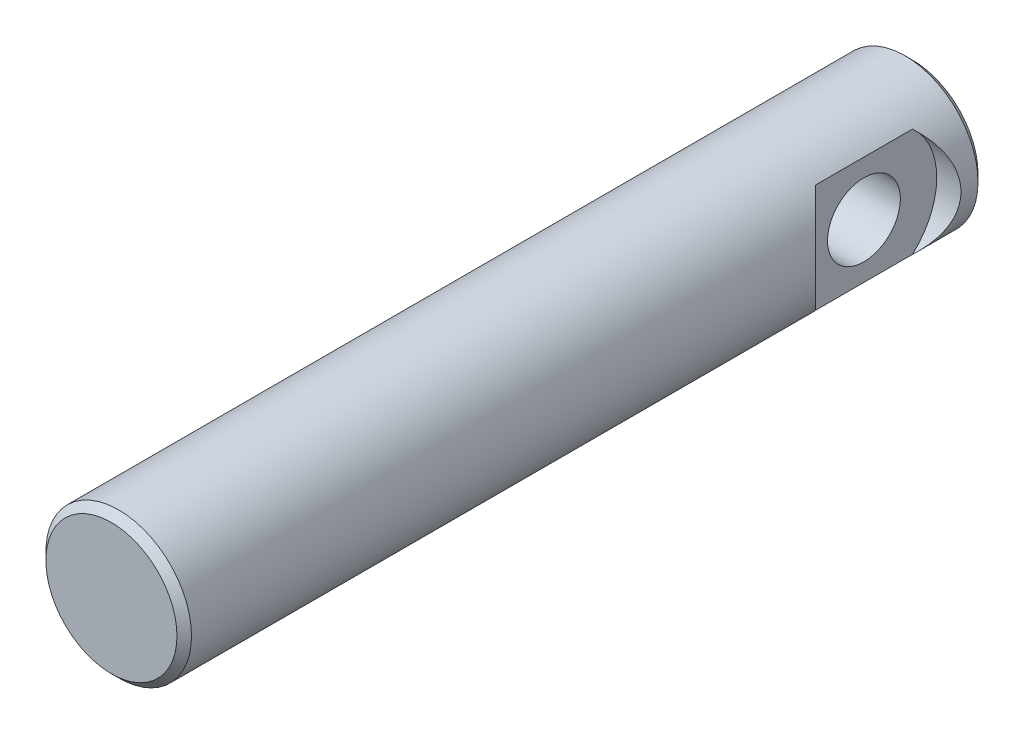
ISO-10303-21;
HEADER;
FILE_DESCRIPTION(('STEP AP214'),'2;1');
FILE_NAME('part.step','',(''),(''),'','','');
FILE_SCHEMA(('AUTOMOTIVE_DESIGN { 1 0 10303 214 1 1 1 1 }'));
ENDSEC;
DATA;
#1=APPLICATION_CONTEXT('core data for automotive mechanical design processes');
#2=APPLICATION_PROTOCOL_DEFINITION('international standard','automotive_design',2000,#1);
#3=PRODUCT_CONTEXT('',#1,'mechanical');
#4=PRODUCT('Part','Part','',(#3));
#5=PRODUCT_RELATED_PRODUCT_CATEGORY('part','',(#4));
#6=PRODUCT_DEFINITION_FORMATION('','',#4);
#7=PRODUCT_DEFINITION_CONTEXT('part definition',#1,'design');
#8=PRODUCT_DEFINITION('design','',#6,#7);
#9=PRODUCT_DEFINITION_SHAPE('','',#8);
#10=(LENGTH_UNIT() NAMED_UNIT(*) SI_UNIT(.MILLI.,.METRE.));
#11=(NAMED_UNIT(*) PLANE_ANGLE_UNIT() SI_UNIT($,.RADIAN.));
#12=(NAMED_UNIT(*) SI_UNIT($,.STERADIAN.) SOLID_ANGLE_UNIT());
#13=UNCERTAINTY_MEASURE_WITH_UNIT(LENGTH_MEASURE(1.E-05),#10,'distance_accuracy_value','');
#14=(GEOMETRIC_REPRESENTATION_CONTEXT(3) GLOBAL_UNCERTAINTY_ASSIGNED_CONTEXT((#13)) GLOBAL_UNIT_ASSIGNED_CONTEXT((#10,
#11,#12)) REPRESENTATION_CONTEXT('',''));
#15=CARTESIAN_POINT('',(0.,0.,0.));
#16=DIRECTION('',(0.,0.,1.));
#17=DIRECTION('',(1.,0.,0.));
#18=AXIS2_PLACEMENT_3D('',#15,#16,#17);
#19=CARTESIAN_POINT('',(0.,0.,33.));
#20=DIRECTION('',(0.,0.,-1.));
#21=DIRECTION('',(-1.,0.,0.));
#22=AXIS2_PLACEMENT_3D('',#19,#20,#21);
#23=CYLINDRICAL_SURFACE('',#22,3.);
#24=CARTESIAN_POINT('',(0.,0.,0.300000000000002));
#25=DIRECTION('',(0.,0.,1.));
#26=DIRECTION('',(1.,0.,0.));
#27=AXIS2_PLACEMENT_3D('',#24,#25,#26);
#28=CIRCLE('',#27,3.);
#29=CARTESIAN_POINT('',(3.,0.,0.300000000000002));
#30=VERTEX_POINT('',#29);
#31=EDGE_CURVE('E115',#30,#30,#28,.T.);
#32=ORIENTED_EDGE('',*,*,#31,.T.);
#33=EDGE_LOOP('',(#32));
#34=FACE_BOUND('',#33,.T.);
#35=CARTESIAN_POINT('',(0.,0.,32.7));
#36=DIRECTION('',(0.,0.,1.));
#37=DIRECTION('',(1.,0.,0.));
#38=AXIS2_PLACEMENT_3D('',#35,#36,#37);
#39=CIRCLE('',#38,3.);
#40=CARTESIAN_POINT('',(3.,0.,32.7));
#41=VERTEX_POINT('',#40);
#42=EDGE_CURVE('E67',#41,#41,#39,.F.);
#43=ORIENTED_EDGE('',*,*,#42,.T.);
#44=EDGE_LOOP('',(#43));
#45=FACE_BOUND('',#44,.T.);
#46=CARTESIAN_POINT('',(0.,0.,4.00000000000001));
#47=DIRECTION('',(-0.707106781186548,0.,-0.707106781186547));
#48=DIRECTION('',(0.707106781186547,0.,-0.707106781186548));
#49=AXIS2_PLACEMENT_3D('',#46,#47,#48);
#50=ELLIPSE('',#49,4.24264068711929,3.);
#51=CARTESIAN_POINT('',(2.,-2.2360679774998,2.00000000000001));
#52=VERTEX_POINT('',#51);
#53=CARTESIAN_POINT('',(2.,2.2360679774998,2.00000000000001));
#54=VERTEX_POINT('',#53);
#55=EDGE_CURVE('E60',#52,#54,#50,.F.);
#56=ORIENTED_EDGE('',*,*,#55,.F.);
#57=DIRECTION('',(0.,0.,-1.));
#58=VECTOR('',#57,1.);
#59=CARTESIAN_POINT('',(2.00000000000002,-2.23606797749977,33.));
#60=LINE('',#59,#58);
#61=CARTESIAN_POINT('',(2.,-2.23606797749979,6.00000000000001));
#62=VERTEX_POINT('',#61);
#63=EDGE_CURVE('E68',#62,#52,#60,.T.);
#64=ORIENTED_EDGE('',*,*,#63,.F.);
#65=CARTESIAN_POINT('',(0.,0.,4.00000000000001));
#66=DIRECTION('',(0.707106781186547,0.,-0.707106781186548));
#67=DIRECTION('',(-0.707106781186548,0.,-0.707106781186547));
#68=AXIS2_PLACEMENT_3D('',#65,#66,#67);
#69=ELLIPSE('',#68,4.24264068711929,3.);
#70=CARTESIAN_POINT('',(2.,2.23606797749979,6.00000000000001));
#71=VERTEX_POINT('',#70);
#72=EDGE_CURVE('E51',#71,#62,#69,.T.);
#73=ORIENTED_EDGE('',*,*,#72,.F.);
#74=DIRECTION('',(0.,0.,-1.));
#75=VECTOR('',#74,1.);
#76=CARTESIAN_POINT('',(2.00000000000002,2.23606797749977,33.));
#77=LINE('',#76,#75);
#78=EDGE_CURVE('E72',#54,#71,#77,.F.);
#79=ORIENTED_EDGE('',*,*,#78,.F.);
#80=EDGE_LOOP('',(#56,#64,#73,#79));
#81=FACE_BOUND('',#80,.T.);
#82=CARTESIAN_POINT('',(-3.,0.,5.50000000000002));
#83=CARTESIAN_POINT('',(-2.99999570107562,0.0788579444268507,5.49999504652423));
#84=CARTESIAN_POINT('',(-2.99685736529635,0.157809899546345,5.49374489031844));
#85=CARTESIAN_POINT('',(-2.98461234055735,0.313380352903346,5.46902067948771));
#86=CARTESIAN_POINT('',(-2.97549431743379,0.389994130070447,5.4505234105033));
#87=CARTESIAN_POINT('',(-2.95224419105063,0.538400317320677,5.40220928707508));
#88=CARTESIAN_POINT('',(-2.93813158766306,0.610210204408723,5.37243642362807));
#89=CARTESIAN_POINT('',(-2.90618664773642,0.747708925209902,5.30264406795254));
#90=CARTESIAN_POINT('',(-2.88835460450288,0.813398240985093,5.26262538362672));
#91=CARTESIAN_POINT('',(-2.84934387387093,0.941261726642869,5.17072412577209));
#92=CARTESIAN_POINT('',(-2.82802798691305,1.00298281668317,5.11827028114056));
#93=CARTESIAN_POINT('',(-2.78489955370114,1.11716916730048,5.00421778112946));
#94=CARTESIAN_POINT('',(-2.76308664313552,1.16962737466016,4.94261222234136));
#95=CARTESIAN_POINT('',(-2.71948426796021,1.26787800067542,4.80627497571495));
#96=CARTESIAN_POINT('',(-2.69782780455197,1.31283800332746,4.73089585248115));
#97=CARTESIAN_POINT('',(-2.6592896815848,1.38925234033605,4.57244899602069));
#98=CARTESIAN_POINT('',(-2.64240461410484,1.42071632244951,4.48938680691589));
#99=CARTESIAN_POINT('',(-2.61686800556712,1.46719866328289,4.32300234186713));
#100=CARTESIAN_POINT('',(-2.6077840737557,1.48308878562067,4.23999332189892));
#101=CARTESIAN_POINT('',(-2.59772834922791,1.50064048996328,4.0720317433308));
#102=CARTESIAN_POINT('',(-2.59674854014931,1.50231613255962,3.98708118869328));
#103=CARTESIAN_POINT('',(-2.60266395385872,1.49203093075845,3.82857096352696));
#104=CARTESIAN_POINT('',(-2.6086314549302,1.48167683930524,3.75486395316543));
#105=CARTESIAN_POINT('',(-2.62614343100775,1.45040977358541,3.61041713594045));
#106=CARTESIAN_POINT('',(-2.63768968247664,1.42949343584649,3.53967828204203));
#107=CARTESIAN_POINT('',(-2.66531214619111,1.37731467057902,3.40115630115152));
#108=CARTESIAN_POINT('',(-2.68148760995997,1.345822600674,3.33348040182132));
#109=CARTESIAN_POINT('',(-2.71655106422105,1.27356253150201,3.20404856111499));
#110=CARTESIAN_POINT('',(-2.73544027170285,1.23279036571871,3.14229529659987));
#111=CARTESIAN_POINT('',(-2.77669736854928,1.13709908236919,3.01821812088517));
#112=CARTESIAN_POINT('',(-2.79920265355119,1.08104168755393,2.95681468963577));
#113=CARTESIAN_POINT('',(-2.8432143495061,0.959333368112069,2.84389687211365));
#114=CARTESIAN_POINT('',(-2.86472027938201,0.893677884861437,2.79238721194918));
#115=CARTESIAN_POINT('',(-2.90552980924446,0.750774758747781,2.69847150845541));
#116=CARTESIAN_POINT('',(-2.92468476243011,0.673130387399121,2.65659929133139));
#117=CARTESIAN_POINT('',(-2.95736821681863,0.510699323233201,2.58685445643549));
#118=CARTESIAN_POINT('',(-2.9709011841533,0.425918364397919,2.55897072247725));
#119=CARTESIAN_POINT('',(-2.98986500612153,0.259149737491058,2.52028689442499));
#120=CARTESIAN_POINT('',(-2.99587407451965,0.177512295822493,2.50826314637983));
#121=CARTESIAN_POINT('',(-3.00109520188655,0.01316939992403,2.49780290329827));
#122=CARTESIAN_POINT('',(-3.00031048081978,-0.0695355298048611,2.4993599715408));
#123=CARTESIAN_POINT('',(-2.99236788380152,-0.226849457978979,2.51531003262812));
#124=CARTESIAN_POINT('',(-2.98570868532252,-0.301589112074895,2.52869879909499));
#125=CARTESIAN_POINT('',(-2.9673325697226,-0.447610338452912,2.56635710784268));
#126=CARTESIAN_POINT('',(-2.95561509501618,-0.518891528536631,2.59062784968024));
#127=CARTESIAN_POINT('',(-2.92776377120382,-0.658332912674361,2.64999769964955));
#128=CARTESIAN_POINT('',(-2.91151322654446,-0.726345595508707,2.68538657517443));
#129=CARTESIAN_POINT('',(-2.87615961476126,-0.85569204254891,2.76566130346985));
#130=CARTESIAN_POINT('',(-2.85705533350407,-0.917022944664891,2.81055120189309));
#131=CARTESIAN_POINT('',(-2.81562332004297,-1.03765153393383,2.91364063799607));
#132=CARTESIAN_POINT('',(-2.79316327265249,-1.09615811672855,2.97271430266772));
#133=CARTESIAN_POINT('',(-2.7489358741323,-1.20278448167829,3.09988772691659));
#134=CARTESIAN_POINT('',(-2.7271690110007,-1.25089707856782,3.16799367827188));
#135=CARTESIAN_POINT('',(-2.68576788309734,-1.33756187171853,3.31546548125947));
#136=CARTESIAN_POINT('',(-2.66628794383591,-1.37553824370038,3.39521689914172));
#137=CARTESIAN_POINT('',(-2.63361108441201,-1.43712423890206,3.56126510136245));
#138=CARTESIAN_POINT('',(-2.62040607332624,-1.46075237380053,3.64755328970034));
#139=CARTESIAN_POINT('',(-2.60342251538702,-1.49079253120032,3.81536533432706));
#140=CARTESIAN_POINT('',(-2.59886075197597,-1.49863949460819,3.89655138015287));
#141=CARTESIAN_POINT('',(-2.59748031962404,-1.50103373156431,4.05917060074679));
#142=CARTESIAN_POINT('',(-2.60065829439584,-1.49558676993487,4.1406036531068));
#143=CARTESIAN_POINT('',(-2.61356793076614,-1.47288918838998,4.29322525230016));
#144=CARTESIAN_POINT('',(-2.62264641723987,-1.45681247151456,4.36465070521712));
#145=CARTESIAN_POINT('',(-2.64556524281478,-1.41476303733663,4.50371217913656));
#146=CARTESIAN_POINT('',(-2.65940711354502,-1.38878713673989,4.57134697313806));
#147=CARTESIAN_POINT('',(-2.69142795546803,-1.32572361795086,4.70593727647982));
#148=CARTESIAN_POINT('',(-2.7098358359388,-1.28800670672356,4.77254185274355));
#149=CARTESIAN_POINT('',(-2.7485299745229,-1.2032264574561,4.8989118042719));
#150=CARTESIAN_POINT('',(-2.76881720693415,-1.15615825686235,4.95867359578168));
#151=CARTESIAN_POINT('',(-2.81193484737138,-1.04730498999207,5.07721297353203));
#152=CARTESIAN_POINT('',(-2.83477474959942,-0.984426634495904,5.13498865352545));
#153=CARTESIAN_POINT('',(-2.87816628389896,-0.849232209349807,5.23939447515292));
#154=CARTESIAN_POINT('',(-2.89871667939292,-0.776911084957807,5.28601860920488));
#155=CARTESIAN_POINT('',(-2.93547014349806,-0.623897395174429,5.36685454406812));
#156=CARTESIAN_POINT('',(-2.95164144740899,-0.543149255665106,5.40097625385472));
#157=CARTESIAN_POINT('',(-2.9775201194848,-0.376113151707138,5.45471225163613));
#158=CARTESIAN_POINT('',(-2.98724585044602,-0.289841699383657,5.47436777020859));
#159=CARTESIAN_POINT('',(-2.99543192870217,-0.168902919736348,5.49084611662863));
#160=CARTESIAN_POINT('',(-2.99714048010376,-0.135242819162352,5.49427396129953));
#161=CARTESIAN_POINT('',(-2.99942545465223,-0.0677275977076401,5.49885199827115));
#162=CARTESIAN_POINT('',(-3.00000184655071,-0.033872471469944,5.50000212770533));
#163=CARTESIAN_POINT('',(-3.,0.,5.50000000000002));
#164=B_SPLINE_CURVE_WITH_KNOTS('',3,(#82,#83,#84,#85,#86,#87,#88,#89,#90,#91,#92,#93,#94,#95,
#96,#97,#98,#99,#100,#101,#102,#103,#104,#105,#106,#107,#108,#109,#110,#111,#112,#113,#114,#115,
#116,#117,#118,#119,#120,#121,#122,#123,#124,#125,#126,#127,#128,#129,#130,#131,#132,#133,#134,
#135,#136,#137,#138,#139,#140,#141,#142,#143,#144,#145,#146,#147,#148,#149,#150,#151,#152,#153,
#154,#155,#156,#157,#158,#159,#160,#161,#162,#163),.UNSPECIFIED.,.T.,.F.,(4,2,2,2,2,2,2,2,2,2,2,
2,2,2,2,2,2,2,2,2,2,2,2,2,2,2,2,2,2,2,2,2,2,2,2,2,2,2,2,2,4),(0.,0.23643638613044,
0.473322224563799,0.709293233238452,0.945245640872357,1.19547263807714,1.44588935648106,
1.7157258964613,1.98536921847423,2.23887018210346,2.49212035993532,2.71508568613983,
2.9381220588852,3.16635360252733,3.39468781890335,3.6519741200082,3.90938301898032,
4.17874533321664,4.44789325368422,4.69474935707022,4.94148846767217,5.16910359759186,
5.39674382446401,5.63089284041852,5.86514176122513,6.12239415966632,6.37982382923152,
6.64972023242593,6.91926767918181,7.16293961254575,7.40650589797023,7.62686895373289,
7.84730293182532,8.08254685170436,8.31791341715452,8.58187864135763,8.84598575071874,
9.11196020495296,9.3771736293173,9.47872920200882,9.58028757766606),.UNSPECIFIED.);
#165=CARTESIAN_POINT('',(-3.,0.,5.50000000000002));
#166=VERTEX_POINT('',#165);
#167=EDGE_CURVE('E78',#166,#166,#164,.T.);
#168=ORIENTED_EDGE('',*,*,#167,.F.);
#169=EDGE_LOOP('',(#168));
#170=FACE_BOUND('',#169,.T.);
#171=ADVANCED_FACE('F33',(#34,#45,#81,#170),#23,.T.);
#172=CARTESIAN_POINT('',(0.,0.,33.));
#173=DIRECTION('',(0.,0.,1.));
#174=DIRECTION('',(1.,0.,0.));
#175=AXIS2_PLACEMENT_3D('',#172,#173,#174);
#176=PLANE('',#175);
#177=CARTESIAN_POINT('',(0.,0.,33.));
#178=DIRECTION('',(0.,0.,1.));
#179=DIRECTION('',(1.,0.,0.));
#180=AXIS2_PLACEMENT_3D('',#177,#178,#179);
#181=CIRCLE('',#180,2.7);
#182=CARTESIAN_POINT('',(2.7,0.,33.));
#183=VERTEX_POINT('',#182);
#184=EDGE_CURVE('E11',#183,#183,#181,.T.);
#185=ORIENTED_EDGE('',*,*,#184,.T.);
#186=EDGE_LOOP('',(#185));
#187=FACE_BOUND('',#186,.T.);
#188=ADVANCED_FACE('F100',(#187),#176,.T.);
#189=CARTESIAN_POINT('',(0.,0.,0.));
#190=DIRECTION('',(0.,0.,1.));
#191=DIRECTION('',(1.,0.,0.));
#192=AXIS2_PLACEMENT_3D('',#189,#190,#191);
#193=PLANE('',#192);
#194=CARTESIAN_POINT('',(0.,0.,0.));
#195=DIRECTION('',(0.,0.,1.));
#196=DIRECTION('',(1.,0.,0.));
#197=AXIS2_PLACEMENT_3D('',#194,#195,#196);
#198=CIRCLE('',#197,2.7);
#199=CARTESIAN_POINT('',(2.7,0.,0.));
#200=VERTEX_POINT('',#199);
#201=EDGE_CURVE('E41',#200,#200,#198,.F.);
#202=ORIENTED_EDGE('',*,*,#201,.T.);
#203=EDGE_LOOP('',(#202));
#204=FACE_BOUND('',#203,.T.);
#205=ADVANCED_FACE('F97',(#204),#193,.F.);
#206=CARTESIAN_POINT('',(10.,0.,4.));
#207=DIRECTION('',(-1.,0.,0.));
#208=DIRECTION('',(0.,0.,1.));
#209=AXIS2_PLACEMENT_3D('',#206,#207,#208);
#210=CYLINDRICAL_SURFACE('',#209,1.50000000000001);
#211=CARTESIAN_POINT('',(2.,0.,4.00000000000001));
#212=DIRECTION('',(-1.,0.,0.));
#213=DIRECTION('',(0.,0.,1.));
#214=AXIS2_PLACEMENT_3D('',#211,#212,#213);
#215=CIRCLE('',#214,1.50000000000001);
#216=CARTESIAN_POINT('',(2.,0.,5.50000000000001));
#217=VERTEX_POINT('',#216);
#218=EDGE_CURVE('E73',#217,#217,#215,.T.);
#219=ORIENTED_EDGE('',*,*,#218,.F.);
#220=EDGE_LOOP('',(#219));
#221=FACE_BOUND('',#220,.T.);
#222=ORIENTED_EDGE('',*,*,#167,.T.);
#223=EDGE_LOOP('',(#222));
#224=FACE_BOUND('',#223,.T.);
#225=ADVANCED_FACE('F92',(#221,#224),#210,.F.);
#226=CARTESIAN_POINT('',(2.,0.,2.5));
#227=DIRECTION('',(1.,0.,0.));
#228=DIRECTION('',(0.,0.,-1.));
#229=AXIS2_PLACEMENT_3D('',#226,#227,#228);
#230=PLANE('',#229);
#231=ORIENTED_EDGE('',*,*,#218,.T.);
#232=EDGE_LOOP('',(#231));
#233=FACE_BOUND('',#232,.T.);
#234=ORIENTED_EDGE('',*,*,#63,.T.);
#235=CARTESIAN_POINT('',(2.,0.,4.00000000000001));
#236=DIRECTION('',(-1.,0.,0.));
#237=DIRECTION('',(0.,0.,1.));
#238=AXIS2_PLACEMENT_3D('',#235,#236,#237);
#239=CIRCLE('',#238,3.00000000000001);
#240=EDGE_CURVE('E63',#54,#52,#239,.T.);
#241=ORIENTED_EDGE('',*,*,#240,.F.);
#242=ORIENTED_EDGE('',*,*,#78,.T.);
#243=EDGE_CURVE('E47',#62,#71,#239,.T.);
#244=ORIENTED_EDGE('',*,*,#243,.F.);
#245=EDGE_LOOP('',(#234,#241,#242,#244));
#246=FACE_BOUND('',#245,.T.);
#247=ADVANCED_FACE('F71',(#233,#246),#230,.T.);
#248=CARTESIAN_POINT('',(10.,0.,4.));
#249=DIRECTION('',(-1.,0.,0.));
#250=DIRECTION('',(0.,0.,1.));
#251=AXIS2_PLACEMENT_3D('',#248,#249,#250);
#252=CYLINDRICAL_SURFACE('',#251,3.);
#253=ORIENTED_EDGE('',*,*,#55,.T.);
#254=ORIENTED_EDGE('',*,*,#240,.T.);
#255=EDGE_LOOP('',(#253,#254));
#256=FACE_BOUND('',#255,.T.);
#257=ADVANCED_FACE('F62',(#256),#252,.F.);
#258=ORIENTED_EDGE('',*,*,#72,.T.);
#259=ORIENTED_EDGE('',*,*,#243,.T.);
#260=EDGE_LOOP('',(#258,#259));
#261=FACE_BOUND('',#260,.T.);
#262=ADVANCED_FACE('F124',(#261),#252,.F.);
#263=CARTESIAN_POINT('',(0.,0.,0.300000000000002));
#264=DIRECTION('',(0.,0.,1.));
#265=DIRECTION('',(1.,0.,0.));
#266=AXIS2_PLACEMENT_3D('',#263,#264,#265);
#267=CONICAL_SURFACE('',#266,3.,0.785398163397449);
#268=ORIENTED_EDGE('',*,*,#201,.F.);
#269=EDGE_LOOP('',(#268));
#270=FACE_BOUND('',#269,.T.);
#271=ORIENTED_EDGE('',*,*,#31,.F.);
#272=EDGE_LOOP('',(#271));
#273=FACE_BOUND('',#272,.T.);
#274=ADVANCED_FACE('F121',(#270,#273),#267,.T.);
#275=CARTESIAN_POINT('',(0.,0.,33.));
#276=DIRECTION('',(0.,0.,-1.));
#277=DIRECTION('',(-1.,0.,0.));
#278=AXIS2_PLACEMENT_3D('',#275,#276,#277);
#279=CONICAL_SURFACE('',#278,2.7,0.785398163397449);
#280=ORIENTED_EDGE('',*,*,#42,.F.);
#281=EDGE_LOOP('',(#280));
#282=FACE_BOUND('',#281,.T.);
#283=ORIENTED_EDGE('',*,*,#184,.F.);
#284=EDGE_LOOP('',(#283));
#285=FACE_BOUND('',#284,.T.);
#286=ADVANCED_FACE('F35',(#282,#285),#279,.T.);
#287=CLOSED_SHELL('',(#171,#188,#205,#225,#247,#257,#262,#274,#286));
#288=MANIFOLD_SOLID_BREP('B2',#287);
#289=ADVANCED_BREP_SHAPE_REPRESENTATION('',(#18,#288),#14);
#290=SHAPE_DEFINITION_REPRESENTATION(#9,#289);
ENDSEC;
END-ISO-10303-21;
